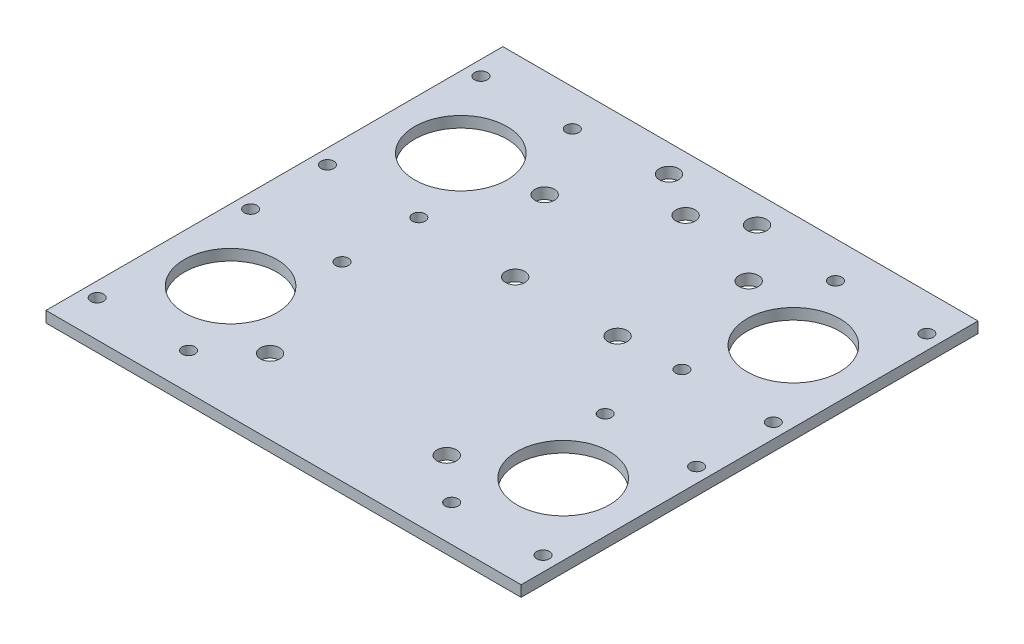
ISO-10303-21;
HEADER;
FILE_DESCRIPTION(('STEP AP214'),'2;1');
FILE_NAME('part.step','',(''),(''),'','','');
FILE_SCHEMA(('AUTOMOTIVE_DESIGN { 1 0 10303 214 1 1 1 1 }'));
ENDSEC;
DATA;
#1=APPLICATION_CONTEXT('core data for automotive mechanical design processes');
#2=APPLICATION_PROTOCOL_DEFINITION('international standard','automotive_design',2000,#1);
#3=PRODUCT_CONTEXT('',#1,'mechanical');
#4=PRODUCT('Part','Part','',(#3));
#5=PRODUCT_RELATED_PRODUCT_CATEGORY('part','',(#4));
#6=PRODUCT_DEFINITION_FORMATION('','',#4);
#7=PRODUCT_DEFINITION_CONTEXT('part definition',#1,'design');
#8=PRODUCT_DEFINITION('design','',#6,#7);
#9=PRODUCT_DEFINITION_SHAPE('','',#8);
#10=(LENGTH_UNIT() NAMED_UNIT(*) SI_UNIT(.MILLI.,.METRE.));
#11=(NAMED_UNIT(*) PLANE_ANGLE_UNIT() SI_UNIT($,.RADIAN.));
#12=(NAMED_UNIT(*) SI_UNIT($,.STERADIAN.) SOLID_ANGLE_UNIT());
#13=UNCERTAINTY_MEASURE_WITH_UNIT(LENGTH_MEASURE(1.E-05),#10,'distance_accuracy_value','');
#14=(GEOMETRIC_REPRESENTATION_CONTEXT(3) GLOBAL_UNCERTAINTY_ASSIGNED_CONTEXT((#13)) GLOBAL_UNIT_ASSIGNED_CONTEXT((#10,
#11,#12)) REPRESENTATION_CONTEXT('',''));
#15=CARTESIAN_POINT('',(0.,0.,0.));
#16=DIRECTION('',(0.,0.,1.));
#17=DIRECTION('',(1.,0.,0.));
#18=AXIS2_PLACEMENT_3D('',#15,#16,#17);
#19=CARTESIAN_POINT('',(65.,3.,-62.5));
#20=DIRECTION('',(-1.,0.,0.));
#21=DIRECTION('',(0.,0.,1.));
#22=AXIS2_PLACEMENT_3D('',#19,#20,#21);
#23=PLANE('',#22);
#24=DIRECTION('',(0.,0.,-1.));
#25=VECTOR('',#24,1.);
#26=CARTESIAN_POINT('',(65.,0.,-62.5));
#27=LINE('',#26,#25);
#28=CARTESIAN_POINT('',(65.,0.,62.5));
#29=VERTEX_POINT('',#28);
#30=CARTESIAN_POINT('',(65.,0.,-62.5));
#31=VERTEX_POINT('',#30);
#32=EDGE_CURVE('E109',#29,#31,#27,.T.);
#33=ORIENTED_EDGE('',*,*,#32,.T.);
#34=DIRECTION('',(0.,-1.,0.));
#35=VECTOR('',#34,1.);
#36=CARTESIAN_POINT('',(65.,3.,-62.5));
#37=LINE('',#36,#35);
#38=CARTESIAN_POINT('',(65.,3.,-62.5));
#39=VERTEX_POINT('',#38);
#40=EDGE_CURVE('E11',#39,#31,#37,.T.);
#41=ORIENTED_EDGE('',*,*,#40,.F.);
#42=DIRECTION('',(0.,0.,-1.));
#43=VECTOR('',#42,1.);
#44=CARTESIAN_POINT('',(65.,3.,-62.5));
#45=LINE('',#44,#43);
#46=CARTESIAN_POINT('',(65.,3.,62.5));
#47=VERTEX_POINT('',#46);
#48=EDGE_CURVE('E92',#47,#39,#45,.T.);
#49=ORIENTED_EDGE('',*,*,#48,.F.);
#50=DIRECTION('',(0.,-1.,0.));
#51=VECTOR('',#50,1.);
#52=CARTESIAN_POINT('',(65.,3.,62.5));
#53=LINE('',#52,#51);
#54=EDGE_CURVE('E105',#47,#29,#53,.T.);
#55=ORIENTED_EDGE('',*,*,#54,.T.);
#56=EDGE_LOOP('',(#33,#41,#49,#55));
#57=FACE_BOUND('',#56,.T.);
#58=ADVANCED_FACE('F38',(#57),#23,.F.);
#59=CARTESIAN_POINT('',(-65.,3.,-62.5));
#60=DIRECTION('',(0.,0.,1.));
#61=DIRECTION('',(1.,0.,0.));
#62=AXIS2_PLACEMENT_3D('',#59,#60,#61);
#63=PLANE('',#62);
#64=DIRECTION('',(-1.,0.,0.));
#65=VECTOR('',#64,1.);
#66=CARTESIAN_POINT('',(-65.,0.,-62.5));
#67=LINE('',#66,#65);
#68=CARTESIAN_POINT('',(-65.,0.,-62.5));
#69=VERTEX_POINT('',#68);
#70=EDGE_CURVE('E97',#31,#69,#67,.T.);
#71=ORIENTED_EDGE('',*,*,#70,.T.);
#72=DIRECTION('',(0.,-1.,0.));
#73=VECTOR('',#72,1.);
#74=CARTESIAN_POINT('',(-65.,3.,-62.5));
#75=LINE('',#74,#73);
#76=CARTESIAN_POINT('',(-65.,3.,-62.5));
#77=VERTEX_POINT('',#76);
#78=EDGE_CURVE('E48',#77,#69,#75,.T.);
#79=ORIENTED_EDGE('',*,*,#78,.F.);
#80=DIRECTION('',(-1.,0.,0.));
#81=VECTOR('',#80,1.);
#82=CARTESIAN_POINT('',(-65.,3.,-62.5));
#83=LINE('',#82,#81);
#84=EDGE_CURVE('E87',#39,#77,#83,.T.);
#85=ORIENTED_EDGE('',*,*,#84,.F.);
#86=ORIENTED_EDGE('',*,*,#40,.T.);
#87=EDGE_LOOP('',(#71,#79,#85,#86));
#88=FACE_BOUND('',#87,.T.);
#89=ADVANCED_FACE('F96',(#88),#63,.F.);
#90=CARTESIAN_POINT('',(-65.,3.,-62.5));
#91=DIRECTION('',(1.,0.,0.));
#92=DIRECTION('',(0.,0.,-1.));
#93=AXIS2_PLACEMENT_3D('',#90,#91,#92);
#94=PLANE('',#93);
#95=DIRECTION('',(0.,0.,1.));
#96=VECTOR('',#95,1.);
#97=CARTESIAN_POINT('',(-65.,0.,-62.5));
#98=LINE('',#97,#96);
#99=CARTESIAN_POINT('',(-65.,0.,62.5));
#100=VERTEX_POINT('',#99);
#101=EDGE_CURVE('E74',#69,#100,#98,.T.);
#102=ORIENTED_EDGE('',*,*,#101,.T.);
#103=DIRECTION('',(0.,-1.,0.));
#104=VECTOR('',#103,1.);
#105=CARTESIAN_POINT('',(-65.,3.,62.5));
#106=LINE('',#105,#104);
#107=CARTESIAN_POINT('',(-65.,3.,62.5));
#108=VERTEX_POINT('',#107);
#109=EDGE_CURVE('E99',#108,#100,#106,.T.);
#110=ORIENTED_EDGE('',*,*,#109,.F.);
#111=DIRECTION('',(0.,0.,1.));
#112=VECTOR('',#111,1.);
#113=CARTESIAN_POINT('',(-65.,3.,-62.5));
#114=LINE('',#113,#112);
#115=EDGE_CURVE('E90',#77,#108,#114,.T.);
#116=ORIENTED_EDGE('',*,*,#115,.F.);
#117=ORIENTED_EDGE('',*,*,#78,.T.);
#118=EDGE_LOOP('',(#102,#110,#116,#117));
#119=FACE_BOUND('',#118,.T.);
#120=ADVANCED_FACE('F101',(#119),#94,.F.);
#121=CARTESIAN_POINT('',(-65.,3.,62.5));
#122=DIRECTION('',(0.,0.,-1.));
#123=DIRECTION('',(-1.,0.,0.));
#124=AXIS2_PLACEMENT_3D('',#121,#122,#123);
#125=PLANE('',#124);
#126=DIRECTION('',(1.,0.,0.));
#127=VECTOR('',#126,1.);
#128=CARTESIAN_POINT('',(-65.,0.,62.5));
#129=LINE('',#128,#127);
#130=EDGE_CURVE('E80',#100,#29,#129,.T.);
#131=ORIENTED_EDGE('',*,*,#130,.T.);
#132=ORIENTED_EDGE('',*,*,#54,.F.);
#133=DIRECTION('',(1.,0.,0.));
#134=VECTOR('',#133,1.);
#135=CARTESIAN_POINT('',(-65.,3.,62.5));
#136=LINE('',#135,#134);
#137=EDGE_CURVE('E57',#108,#47,#136,.T.);
#138=ORIENTED_EDGE('',*,*,#137,.F.);
#139=ORIENTED_EDGE('',*,*,#109,.T.);
#140=EDGE_LOOP('',(#131,#132,#138,#139));
#141=FACE_BOUND('',#140,.T.);
#142=ADVANCED_FACE('F368',(#141),#125,.F.);
#143=CARTESIAN_POINT('',(0.,3.,0.));
#144=DIRECTION('',(0.,1.,0.));
#145=DIRECTION('',(0.,0.,1.));
#146=AXIS2_PLACEMENT_3D('',#143,#144,#145);
#147=PLANE('',#146);
#148=CARTESIAN_POINT('',(0.,3.,-47.5));
#149=DIRECTION('',(0.,1.,0.));
#150=DIRECTION('',(0.,0.,1.));
#151=AXIS2_PLACEMENT_3D('',#148,#149,#150);
#152=CIRCLE('',#151,2.65);
#153=CARTESIAN_POINT('',(0.,3.,-44.85));
#154=VERTEX_POINT('',#153);
#155=EDGE_CURVE('E240',#154,#154,#152,.T.);
#156=ORIENTED_EDGE('',*,*,#155,.F.);
#157=EDGE_LOOP('',(#156));
#158=FACE_BOUND('',#157,.T.);
#159=CARTESIAN_POINT('',(12.0498102049993,3.,-55.));
#160=DIRECTION('',(0.,1.,0.));
#161=DIRECTION('',(0.,0.,1.));
#162=AXIS2_PLACEMENT_3D('',#159,#160,#161);
#163=CIRCLE('',#162,2.65);
#164=CARTESIAN_POINT('',(12.0498102049993,3.,-52.35));
#165=VERTEX_POINT('',#164);
#166=EDGE_CURVE('E354',#165,#165,#163,.T.);
#167=ORIENTED_EDGE('',*,*,#166,.F.);
#168=EDGE_LOOP('',(#167));
#169=FACE_BOUND('',#168,.T.);
#170=CARTESIAN_POINT('',(-12.0498102049993,3.,-55.));
#171=DIRECTION('',(0.,1.,0.));
#172=DIRECTION('',(0.,0.,1.));
#173=AXIS2_PLACEMENT_3D('',#170,#171,#172);
#174=CIRCLE('',#173,2.65);
#175=CARTESIAN_POINT('',(-12.0498102049993,3.,-52.35));
#176=VERTEX_POINT('',#175);
#177=EDGE_CURVE('E350',#176,#176,#174,.T.);
#178=ORIENTED_EDGE('',*,*,#177,.F.);
#179=EDGE_LOOP('',(#178));
#180=FACE_BOUND('',#179,.T.);
#181=CARTESIAN_POINT('',(24.17,3.,-40.6));
#182=DIRECTION('',(0.,1.,0.));
#183=DIRECTION('',(0.,0.,1.));
#184=AXIS2_PLACEMENT_3D('',#181,#182,#183);
#185=CIRCLE('',#184,2.65);
#186=CARTESIAN_POINT('',(24.17,3.,-37.95));
#187=VERTEX_POINT('',#186);
#188=EDGE_CURVE('E247',#187,#187,#185,.T.);
#189=ORIENTED_EDGE('',*,*,#188,.F.);
#190=EDGE_LOOP('',(#189));
#191=FACE_BOUND('',#190,.T.);
#192=CARTESIAN_POINT('',(24.17,3.,42.03));
#193=DIRECTION('',(0.,1.,0.));
#194=DIRECTION('',(0.,0.,1.));
#195=AXIS2_PLACEMENT_3D('',#192,#193,#194);
#196=CIRCLE('',#195,2.65);
#197=CARTESIAN_POINT('',(24.17,3.,44.68));
#198=VERTEX_POINT('',#197);
#199=EDGE_CURVE('E267',#198,#198,#196,.T.);
#200=ORIENTED_EDGE('',*,*,#199,.F.);
#201=EDGE_LOOP('',(#200));
#202=FACE_BOUND('',#201,.T.);
#203=CARTESIAN_POINT('',(-8.73,3.,-9.6));
#204=DIRECTION('',(0.,1.,0.));
#205=DIRECTION('',(0.,0.,1.));
#206=AXIS2_PLACEMENT_3D('',#203,#204,#205);
#207=CIRCLE('',#206,2.65);
#208=CARTESIAN_POINT('',(-8.73,3.,-6.95));
#209=VERTEX_POINT('',#208);
#210=EDGE_CURVE('E262',#209,#209,#207,.T.);
#211=ORIENTED_EDGE('',*,*,#210,.F.);
#212=EDGE_LOOP('',(#211));
#213=FACE_BOUND('',#212,.T.);
#214=CARTESIAN_POINT('',(19.29,3.,-9.6));
#215=DIRECTION('',(0.,1.,0.));
#216=DIRECTION('',(0.,0.,1.));
#217=AXIS2_PLACEMENT_3D('',#214,#215,#216);
#218=CIRCLE('',#217,2.65);
#219=CARTESIAN_POINT('',(19.29,3.,-6.95));
#220=VERTEX_POINT('',#219);
#221=EDGE_CURVE('E258',#220,#220,#218,.T.);
#222=ORIENTED_EDGE('',*,*,#221,.F.);
#223=EDGE_LOOP('',(#222));
#224=FACE_BOUND('',#223,.T.);
#225=CARTESIAN_POINT('',(-24.17,3.,-33.11));
#226=DIRECTION('',(0.,1.,0.));
#227=DIRECTION('',(0.,0.,1.));
#228=AXIS2_PLACEMENT_3D('',#225,#226,#227);
#229=CIRCLE('',#228,2.65);
#230=CARTESIAN_POINT('',(-24.17,3.,-30.46));
#231=VERTEX_POINT('',#230);
#232=EDGE_CURVE('E252',#231,#231,#229,.T.);
#233=ORIENTED_EDGE('',*,*,#232,.F.);
#234=EDGE_LOOP('',(#233));
#235=FACE_BOUND('',#234,.T.);
#236=CARTESIAN_POINT('',(-24.17,3.,42.03));
#237=DIRECTION('',(0.,1.,0.));
#238=DIRECTION('',(0.,0.,1.));
#239=AXIS2_PLACEMENT_3D('',#236,#237,#238);
#240=CIRCLE('',#239,2.65);
#241=CARTESIAN_POINT('',(-24.17,3.,44.68));
#242=VERTEX_POINT('',#241);
#243=EDGE_CURVE('E215',#242,#242,#240,.T.);
#244=ORIENTED_EDGE('',*,*,#243,.F.);
#245=EDGE_LOOP('',(#244));
#246=FACE_BOUND('',#245,.T.);
#247=CARTESIAN_POINT('',(-36.,3.,-52.5));
#248=DIRECTION('',(0.,-1.,0.));
#249=DIRECTION('',(0.,0.,-1.));
#250=AXIS2_PLACEMENT_3D('',#247,#248,#249);
#251=CIRCLE('',#250,1.75);
#252=CARTESIAN_POINT('',(-36.,3.,-54.25));
#253=VERTEX_POINT('',#252);
#254=EDGE_CURVE('E276',#253,#253,#251,.T.);
#255=ORIENTED_EDGE('',*,*,#254,.T.);
#256=EDGE_LOOP('',(#255));
#257=FACE_BOUND('',#256,.T.);
#258=CARTESIAN_POINT('',(-36.,3.,-10.5));
#259=DIRECTION('',(0.,-1.,0.));
#260=DIRECTION('',(0.,0.,-1.));
#261=AXIS2_PLACEMENT_3D('',#258,#259,#260);
#262=CIRCLE('',#261,1.75);
#263=CARTESIAN_POINT('',(-36.,3.,-12.25));
#264=VERTEX_POINT('',#263);
#265=EDGE_CURVE('E272',#264,#264,#262,.T.);
#266=ORIENTED_EDGE('',*,*,#265,.T.);
#267=EDGE_LOOP('',(#266));
#268=FACE_BOUND('',#267,.T.);
#269=CARTESIAN_POINT('',(-61.,3.,-10.5));
#270=DIRECTION('',(0.,-1.,0.));
#271=DIRECTION('',(0.,0.,-1.));
#272=AXIS2_PLACEMENT_3D('',#269,#270,#271);
#273=CIRCLE('',#272,1.75);
#274=CARTESIAN_POINT('',(-61.,3.,-12.25));
#275=VERTEX_POINT('',#274);
#276=EDGE_CURVE('E268',#275,#275,#273,.T.);
#277=ORIENTED_EDGE('',*,*,#276,.T.);
#278=EDGE_LOOP('',(#277));
#279=FACE_BOUND('',#278,.T.);
#280=CARTESIAN_POINT('',(-45.5,3.,-31.5));
#281=DIRECTION('',(0.,-1.,0.));
#282=DIRECTION('',(0.,0.,-1.));
#283=AXIS2_PLACEMENT_3D('',#280,#281,#282);
#284=CIRCLE('',#283,12.65);
#285=CARTESIAN_POINT('',(-45.5,3.,-44.15));
#286=VERTEX_POINT('',#285);
#287=EDGE_CURVE('E235',#286,#286,#284,.T.);
#288=ORIENTED_EDGE('',*,*,#287,.T.);
#289=EDGE_LOOP('',(#288));
#290=FACE_BOUND('',#289,.T.);
#291=CARTESIAN_POINT('',(-61.,3.,-52.5));
#292=DIRECTION('',(0.,-1.,0.));
#293=DIRECTION('',(0.,0.,-1.));
#294=AXIS2_PLACEMENT_3D('',#291,#292,#293);
#295=CIRCLE('',#294,1.75);
#296=CARTESIAN_POINT('',(-61.,3.,-54.25));
#297=VERTEX_POINT('',#296);
#298=EDGE_CURVE('E193',#297,#297,#295,.T.);
#299=ORIENTED_EDGE('',*,*,#298,.T.);
#300=EDGE_LOOP('',(#299));
#301=FACE_BOUND('',#300,.T.);
#302=CARTESIAN_POINT('',(36.,3.,-52.5));
#303=DIRECTION('',(0.,1.,0.));
#304=DIRECTION('',(0.,0.,-1.));
#305=AXIS2_PLACEMENT_3D('',#302,#303,#304);
#306=CIRCLE('',#305,1.75);
#307=CARTESIAN_POINT('',(36.,3.,-54.25));
#308=VERTEX_POINT('',#307);
#309=EDGE_CURVE('E294',#308,#308,#306,.T.);
#310=ORIENTED_EDGE('',*,*,#309,.F.);
#311=EDGE_LOOP('',(#310));
#312=FACE_BOUND('',#311,.T.);
#313=CARTESIAN_POINT('',(36.,3.,-10.5));
#314=DIRECTION('',(0.,1.,0.));
#315=DIRECTION('',(0.,0.,-1.));
#316=AXIS2_PLACEMENT_3D('',#313,#314,#315);
#317=CIRCLE('',#316,1.75);
#318=CARTESIAN_POINT('',(36.,3.,-12.25));
#319=VERTEX_POINT('',#318);
#320=EDGE_CURVE('E290',#319,#319,#317,.T.);
#321=ORIENTED_EDGE('',*,*,#320,.F.);
#322=EDGE_LOOP('',(#321));
#323=FACE_BOUND('',#322,.T.);
#324=CARTESIAN_POINT('',(61.,3.,-10.5));
#325=DIRECTION('',(0.,1.,0.));
#326=DIRECTION('',(0.,0.,-1.));
#327=AXIS2_PLACEMENT_3D('',#324,#325,#326);
#328=CIRCLE('',#327,1.75);
#329=CARTESIAN_POINT('',(61.,3.,-12.25));
#330=VERTEX_POINT('',#329);
#331=EDGE_CURVE('E286',#330,#330,#328,.T.);
#332=ORIENTED_EDGE('',*,*,#331,.F.);
#333=EDGE_LOOP('',(#332));
#334=FACE_BOUND('',#333,.T.);
#335=CARTESIAN_POINT('',(45.5,3.,-31.5));
#336=DIRECTION('',(0.,1.,0.));
#337=DIRECTION('',(0.,0.,-1.));
#338=AXIS2_PLACEMENT_3D('',#335,#336,#337);
#339=CIRCLE('',#338,12.65);
#340=CARTESIAN_POINT('',(45.5,3.,-44.15));
#341=VERTEX_POINT('',#340);
#342=EDGE_CURVE('E209',#341,#341,#339,.T.);
#343=ORIENTED_EDGE('',*,*,#342,.F.);
#344=EDGE_LOOP('',(#343));
#345=FACE_BOUND('',#344,.T.);
#346=CARTESIAN_POINT('',(61.,3.,-52.5));
#347=DIRECTION('',(0.,1.,0.));
#348=DIRECTION('',(0.,0.,-1.));
#349=AXIS2_PLACEMENT_3D('',#346,#347,#348);
#350=CIRCLE('',#349,1.75);
#351=CARTESIAN_POINT('',(61.,3.,-54.25));
#352=VERTEX_POINT('',#351);
#353=EDGE_CURVE('E171',#352,#352,#350,.T.);
#354=ORIENTED_EDGE('',*,*,#353,.F.);
#355=EDGE_LOOP('',(#354));
#356=FACE_BOUND('',#355,.T.);
#357=CARTESIAN_POINT('',(36.,3.,52.5));
#358=DIRECTION('',(0.,-1.,0.));
#359=DIRECTION('',(0.,0.,1.));
#360=AXIS2_PLACEMENT_3D('',#357,#358,#359);
#361=CIRCLE('',#360,1.75);
#362=CARTESIAN_POINT('',(36.,3.,54.25));
#363=VERTEX_POINT('',#362);
#364=EDGE_CURVE('E312',#363,#363,#361,.T.);
#365=ORIENTED_EDGE('',*,*,#364,.T.);
#366=EDGE_LOOP('',(#365));
#367=FACE_BOUND('',#366,.T.);
#368=CARTESIAN_POINT('',(36.,3.,10.5));
#369=DIRECTION('',(0.,-1.,0.));
#370=DIRECTION('',(0.,0.,1.));
#371=AXIS2_PLACEMENT_3D('',#368,#369,#370);
#372=CIRCLE('',#371,1.75);
#373=CARTESIAN_POINT('',(36.,3.,12.25));
#374=VERTEX_POINT('',#373);
#375=EDGE_CURVE('E308',#374,#374,#372,.T.);
#376=ORIENTED_EDGE('',*,*,#375,.T.);
#377=EDGE_LOOP('',(#376));
#378=FACE_BOUND('',#377,.T.);
#379=CARTESIAN_POINT('',(61.,3.,10.5));
#380=DIRECTION('',(0.,-1.,0.));
#381=DIRECTION('',(0.,0.,1.));
#382=AXIS2_PLACEMENT_3D('',#379,#380,#381);
#383=CIRCLE('',#382,1.75);
#384=CARTESIAN_POINT('',(61.,3.,12.25));
#385=VERTEX_POINT('',#384);
#386=EDGE_CURVE('E304',#385,#385,#383,.T.);
#387=ORIENTED_EDGE('',*,*,#386,.T.);
#388=EDGE_LOOP('',(#387));
#389=FACE_BOUND('',#388,.T.);
#390=CARTESIAN_POINT('',(45.5,3.,31.5));
#391=DIRECTION('',(0.,-1.,0.));
#392=DIRECTION('',(0.,0.,1.));
#393=AXIS2_PLACEMENT_3D('',#390,#391,#392);
#394=CIRCLE('',#393,12.65);
#395=CARTESIAN_POINT('',(45.5,3.,44.15));
#396=VERTEX_POINT('',#395);
#397=EDGE_CURVE('E187',#396,#396,#394,.T.);
#398=ORIENTED_EDGE('',*,*,#397,.T.);
#399=EDGE_LOOP('',(#398));
#400=FACE_BOUND('',#399,.T.);
#401=CARTESIAN_POINT('',(61.,3.,52.5));
#402=DIRECTION('',(0.,-1.,0.));
#403=DIRECTION('',(0.,0.,1.));
#404=AXIS2_PLACEMENT_3D('',#401,#402,#403);
#405=CIRCLE('',#404,1.75);
#406=CARTESIAN_POINT('',(61.,3.,54.25));
#407=VERTEX_POINT('',#406);
#408=EDGE_CURVE('E149',#407,#407,#405,.T.);
#409=ORIENTED_EDGE('',*,*,#408,.T.);
#410=EDGE_LOOP('',(#409));
#411=FACE_BOUND('',#410,.T.);
#412=CARTESIAN_POINT('',(-36.,3.,52.5));
#413=DIRECTION('',(0.,1.,0.));
#414=DIRECTION('',(0.,0.,1.));
#415=AXIS2_PLACEMENT_3D('',#412,#413,#414);
#416=CIRCLE('',#415,1.75);
#417=CARTESIAN_POINT('',(-36.,3.,54.25));
#418=VERTEX_POINT('',#417);
#419=EDGE_CURVE('E330',#418,#418,#416,.T.);
#420=ORIENTED_EDGE('',*,*,#419,.F.);
#421=EDGE_LOOP('',(#420));
#422=FACE_BOUND('',#421,.T.);
#423=CARTESIAN_POINT('',(-36.,3.,10.5));
#424=DIRECTION('',(0.,1.,0.));
#425=DIRECTION('',(0.,0.,1.));
#426=AXIS2_PLACEMENT_3D('',#423,#424,#425);
#427=CIRCLE('',#426,1.75);
#428=CARTESIAN_POINT('',(-36.,3.,12.25));
#429=VERTEX_POINT('',#428);
#430=EDGE_CURVE('E326',#429,#429,#427,.T.);
#431=ORIENTED_EDGE('',*,*,#430,.F.);
#432=EDGE_LOOP('',(#431));
#433=FACE_BOUND('',#432,.T.);
#434=CARTESIAN_POINT('',(-61.,3.,10.5));
#435=DIRECTION('',(0.,1.,0.));
#436=DIRECTION('',(0.,0.,1.));
#437=AXIS2_PLACEMENT_3D('',#434,#435,#436);
#438=CIRCLE('',#437,1.75);
#439=CARTESIAN_POINT('',(-61.,3.,12.25));
#440=VERTEX_POINT('',#439);
#441=EDGE_CURVE('E322',#440,#440,#438,.T.);
#442=ORIENTED_EDGE('',*,*,#441,.F.);
#443=EDGE_LOOP('',(#442));
#444=FACE_BOUND('',#443,.T.);
#445=CARTESIAN_POINT('',(-45.5,3.,31.5));
#446=DIRECTION('',(0.,1.,0.));
#447=DIRECTION('',(0.,0.,1.));
#448=AXIS2_PLACEMENT_3D('',#445,#446,#447);
#449=CIRCLE('',#448,12.65);
#450=CARTESIAN_POINT('',(-45.5,3.,44.15));
#451=VERTEX_POINT('',#450);
#452=EDGE_CURVE('E165',#451,#451,#449,.T.);
#453=ORIENTED_EDGE('',*,*,#452,.F.);
#454=EDGE_LOOP('',(#453));
#455=FACE_BOUND('',#454,.T.);
#456=CARTESIAN_POINT('',(-61.,3.,52.5));
#457=DIRECTION('',(0.,1.,0.));
#458=DIRECTION('',(0.,0.,1.));
#459=AXIS2_PLACEMENT_3D('',#456,#457,#458);
#460=CIRCLE('',#459,1.75);
#461=CARTESIAN_POINT('',(-61.,3.,54.25));
#462=VERTEX_POINT('',#461);
#463=EDGE_CURVE('E129',#462,#462,#460,.T.);
#464=ORIENTED_EDGE('',*,*,#463,.F.);
#465=EDGE_LOOP('',(#464));
#466=FACE_BOUND('',#465,.T.);
#467=ORIENTED_EDGE('',*,*,#48,.T.);
#468=ORIENTED_EDGE('',*,*,#84,.T.);
#469=ORIENTED_EDGE('',*,*,#115,.T.);
#470=ORIENTED_EDGE('',*,*,#137,.T.);
#471=EDGE_LOOP('',(#467,#468,#469,#470));
#472=FACE_BOUND('',#471,.T.);
#473=ADVANCED_FACE('F88',(#158,#169,#180,#191,#202,#213,#224,#235,#246,#257,#268,#279,#290,#301,
#312,#323,#334,#345,#356,#367,#378,#389,#400,#411,#422,#433,#444,#455,#466,#472),#147,.T.);
#474=CARTESIAN_POINT('',(0.,0.,0.));
#475=DIRECTION('',(0.,1.,0.));
#476=DIRECTION('',(0.,0.,1.));
#477=AXIS2_PLACEMENT_3D('',#474,#475,#476);
#478=PLANE('',#477);
#479=CARTESIAN_POINT('',(0.,0.,-47.5));
#480=DIRECTION('',(0.,1.,0.));
#481=DIRECTION('',(0.,0.,1.));
#482=AXIS2_PLACEMENT_3D('',#479,#480,#481);
#483=CIRCLE('',#482,2.65);
#484=CARTESIAN_POINT('',(0.,0.,-44.85));
#485=VERTEX_POINT('',#484);
#486=EDGE_CURVE('E41',#485,#485,#483,.T.);
#487=ORIENTED_EDGE('',*,*,#486,.T.);
#488=EDGE_LOOP('',(#487));
#489=FACE_BOUND('',#488,.T.);
#490=CARTESIAN_POINT('',(12.0498102049993,0.,-55.));
#491=DIRECTION('',(0.,1.,0.));
#492=DIRECTION('',(0.,0.,1.));
#493=AXIS2_PLACEMENT_3D('',#490,#491,#492);
#494=CIRCLE('',#493,2.65);
#495=CARTESIAN_POINT('',(12.0498102049993,0.,-52.35));
#496=VERTEX_POINT('',#495);
#497=EDGE_CURVE('E239',#496,#496,#494,.T.);
#498=ORIENTED_EDGE('',*,*,#497,.T.);
#499=EDGE_LOOP('',(#498));
#500=FACE_BOUND('',#499,.T.);
#501=CARTESIAN_POINT('',(-12.0498102049993,0.,-55.));
#502=DIRECTION('',(0.,1.,0.));
#503=DIRECTION('',(0.,0.,1.));
#504=AXIS2_PLACEMENT_3D('',#501,#502,#503);
#505=CIRCLE('',#504,2.65);
#506=CARTESIAN_POINT('',(-12.0498102049993,0.,-52.35));
#507=VERTEX_POINT('',#506);
#508=EDGE_CURVE('E236',#507,#507,#505,.T.);
#509=ORIENTED_EDGE('',*,*,#508,.T.);
#510=EDGE_LOOP('',(#509));
#511=FACE_BOUND('',#510,.T.);
#512=CARTESIAN_POINT('',(24.17,0.,-40.6));
#513=DIRECTION('',(0.,1.,0.));
#514=DIRECTION('',(0.,0.,1.));
#515=AXIS2_PLACEMENT_3D('',#512,#513,#514);
#516=CIRCLE('',#515,2.65);
#517=CARTESIAN_POINT('',(24.17,0.,-37.95));
#518=VERTEX_POINT('',#517);
#519=EDGE_CURVE('E231',#518,#518,#516,.T.);
#520=ORIENTED_EDGE('',*,*,#519,.T.);
#521=EDGE_LOOP('',(#520));
#522=FACE_BOUND('',#521,.T.);
#523=CARTESIAN_POINT('',(24.17,0.,42.03));
#524=DIRECTION('',(0.,1.,0.));
#525=DIRECTION('',(0.,0.,1.));
#526=AXIS2_PLACEMENT_3D('',#523,#524,#525);
#527=CIRCLE('',#526,2.65);
#528=CARTESIAN_POINT('',(24.17,0.,44.68));
#529=VERTEX_POINT('',#528);
#530=EDGE_CURVE('E227',#529,#529,#527,.T.);
#531=ORIENTED_EDGE('',*,*,#530,.T.);
#532=EDGE_LOOP('',(#531));
#533=FACE_BOUND('',#532,.T.);
#534=CARTESIAN_POINT('',(-8.73,0.,-9.6));
#535=DIRECTION('',(0.,1.,0.));
#536=DIRECTION('',(0.,0.,1.));
#537=AXIS2_PLACEMENT_3D('',#534,#535,#536);
#538=CIRCLE('',#537,2.65);
#539=CARTESIAN_POINT('',(-8.73,0.,-6.95));
#540=VERTEX_POINT('',#539);
#541=EDGE_CURVE('E223',#540,#540,#538,.T.);
#542=ORIENTED_EDGE('',*,*,#541,.T.);
#543=EDGE_LOOP('',(#542));
#544=FACE_BOUND('',#543,.T.);
#545=CARTESIAN_POINT('',(19.29,0.,-9.6));
#546=DIRECTION('',(0.,1.,0.));
#547=DIRECTION('',(0.,0.,1.));
#548=AXIS2_PLACEMENT_3D('',#545,#546,#547);
#549=CIRCLE('',#548,2.65);
#550=CARTESIAN_POINT('',(19.29,0.,-6.95));
#551=VERTEX_POINT('',#550);
#552=EDGE_CURVE('E219',#551,#551,#549,.T.);
#553=ORIENTED_EDGE('',*,*,#552,.T.);
#554=EDGE_LOOP('',(#553));
#555=FACE_BOUND('',#554,.T.);
#556=CARTESIAN_POINT('',(-24.17,0.,-33.11));
#557=DIRECTION('',(0.,1.,0.));
#558=DIRECTION('',(0.,0.,1.));
#559=AXIS2_PLACEMENT_3D('',#556,#557,#558);
#560=CIRCLE('',#559,2.65);
#561=CARTESIAN_POINT('',(-24.17,0.,-30.46));
#562=VERTEX_POINT('',#561);
#563=EDGE_CURVE('E214',#562,#562,#560,.T.);
#564=ORIENTED_EDGE('',*,*,#563,.T.);
#565=EDGE_LOOP('',(#564));
#566=FACE_BOUND('',#565,.T.);
#567=CARTESIAN_POINT('',(-24.17,0.,42.03));
#568=DIRECTION('',(0.,1.,0.));
#569=DIRECTION('',(0.,0.,1.));
#570=AXIS2_PLACEMENT_3D('',#567,#568,#569);
#571=CIRCLE('',#570,2.65);
#572=CARTESIAN_POINT('',(-24.17,0.,44.68));
#573=VERTEX_POINT('',#572);
#574=EDGE_CURVE('E210',#573,#573,#571,.T.);
#575=ORIENTED_EDGE('',*,*,#574,.T.);
#576=EDGE_LOOP('',(#575));
#577=FACE_BOUND('',#576,.T.);
#578=CARTESIAN_POINT('',(-36.,0.,-52.5));
#579=DIRECTION('',(0.,1.,0.));
#580=DIRECTION('',(0.,0.,1.));
#581=AXIS2_PLACEMENT_3D('',#578,#579,#580);
#582=CIRCLE('',#581,1.75);
#583=CARTESIAN_POINT('',(-36.,0.,-50.75));
#584=VERTEX_POINT('',#583);
#585=EDGE_CURVE('E205',#584,#584,#582,.F.);
#586=ORIENTED_EDGE('',*,*,#585,.F.);
#587=EDGE_LOOP('',(#586));
#588=FACE_BOUND('',#587,.T.);
#589=CARTESIAN_POINT('',(-36.,0.,-10.5));
#590=DIRECTION('',(0.,1.,0.));
#591=DIRECTION('',(0.,0.,1.));
#592=AXIS2_PLACEMENT_3D('',#589,#590,#591);
#593=CIRCLE('',#592,1.75);
#594=CARTESIAN_POINT('',(-36.,0.,-8.74999999999999));
#595=VERTEX_POINT('',#594);
#596=EDGE_CURVE('E201',#595,#595,#593,.F.);
#597=ORIENTED_EDGE('',*,*,#596,.F.);
#598=EDGE_LOOP('',(#597));
#599=FACE_BOUND('',#598,.T.);
#600=CARTESIAN_POINT('',(-61.,0.,-10.5));
#601=DIRECTION('',(0.,1.,0.));
#602=DIRECTION('',(0.,0.,1.));
#603=AXIS2_PLACEMENT_3D('',#600,#601,#602);
#604=CIRCLE('',#603,1.75);
#605=CARTESIAN_POINT('',(-61.,0.,-8.75));
#606=VERTEX_POINT('',#605);
#607=EDGE_CURVE('E197',#606,#606,#604,.F.);
#608=ORIENTED_EDGE('',*,*,#607,.F.);
#609=EDGE_LOOP('',(#608));
#610=FACE_BOUND('',#609,.T.);
#611=CARTESIAN_POINT('',(-45.5,0.,-31.5));
#612=DIRECTION('',(0.,1.,0.));
#613=DIRECTION('',(0.,0.,1.));
#614=AXIS2_PLACEMENT_3D('',#611,#612,#613);
#615=CIRCLE('',#614,12.65);
#616=CARTESIAN_POINT('',(-45.5,0.,-18.85));
#617=VERTEX_POINT('',#616);
#618=EDGE_CURVE('E192',#617,#617,#615,.F.);
#619=ORIENTED_EDGE('',*,*,#618,.F.);
#620=EDGE_LOOP('',(#619));
#621=FACE_BOUND('',#620,.T.);
#622=CARTESIAN_POINT('',(-61.,0.,-52.5));
#623=DIRECTION('',(0.,1.,0.));
#624=DIRECTION('',(0.,0.,1.));
#625=AXIS2_PLACEMENT_3D('',#622,#623,#624);
#626=CIRCLE('',#625,1.75);
#627=CARTESIAN_POINT('',(-61.,0.,-50.75));
#628=VERTEX_POINT('',#627);
#629=EDGE_CURVE('E188',#628,#628,#626,.F.);
#630=ORIENTED_EDGE('',*,*,#629,.F.);
#631=EDGE_LOOP('',(#630));
#632=FACE_BOUND('',#631,.T.);
#633=CARTESIAN_POINT('',(36.,0.,-52.5));
#634=DIRECTION('',(0.,1.,0.));
#635=DIRECTION('',(0.,0.,1.));
#636=AXIS2_PLACEMENT_3D('',#633,#634,#635);
#637=CIRCLE('',#636,1.75);
#638=CARTESIAN_POINT('',(36.,0.,-50.75));
#639=VERTEX_POINT('',#638);
#640=EDGE_CURVE('E183',#639,#639,#637,.T.);
#641=ORIENTED_EDGE('',*,*,#640,.T.);
#642=EDGE_LOOP('',(#641));
#643=FACE_BOUND('',#642,.T.);
#644=CARTESIAN_POINT('',(36.,0.,-10.5));
#645=DIRECTION('',(0.,1.,0.));
#646=DIRECTION('',(0.,0.,1.));
#647=AXIS2_PLACEMENT_3D('',#644,#645,#646);
#648=CIRCLE('',#647,1.75);
#649=CARTESIAN_POINT('',(36.,0.,-8.74999999999998));
#650=VERTEX_POINT('',#649);
#651=EDGE_CURVE('E179',#650,#650,#648,.T.);
#652=ORIENTED_EDGE('',*,*,#651,.T.);
#653=EDGE_LOOP('',(#652));
#654=FACE_BOUND('',#653,.T.);
#655=CARTESIAN_POINT('',(61.,0.,-10.5));
#656=DIRECTION('',(0.,1.,0.));
#657=DIRECTION('',(0.,0.,1.));
#658=AXIS2_PLACEMENT_3D('',#655,#656,#657);
#659=CIRCLE('',#658,1.75);
#660=CARTESIAN_POINT('',(61.,0.,-8.74999999999998));
#661=VERTEX_POINT('',#660);
#662=EDGE_CURVE('E175',#661,#661,#659,.T.);
#663=ORIENTED_EDGE('',*,*,#662,.T.);
#664=EDGE_LOOP('',(#663));
#665=FACE_BOUND('',#664,.T.);
#666=CARTESIAN_POINT('',(45.5,0.,-31.5));
#667=DIRECTION('',(0.,1.,0.));
#668=DIRECTION('',(0.,0.,1.));
#669=AXIS2_PLACEMENT_3D('',#666,#667,#668);
#670=CIRCLE('',#669,12.65);
#671=CARTESIAN_POINT('',(45.5,0.,-18.85));
#672=VERTEX_POINT('',#671);
#673=EDGE_CURVE('E170',#672,#672,#670,.T.);
#674=ORIENTED_EDGE('',*,*,#673,.T.);
#675=EDGE_LOOP('',(#674));
#676=FACE_BOUND('',#675,.T.);
#677=CARTESIAN_POINT('',(61.,0.,-52.5));
#678=DIRECTION('',(0.,1.,0.));
#679=DIRECTION('',(0.,0.,1.));
#680=AXIS2_PLACEMENT_3D('',#677,#678,#679);
#681=CIRCLE('',#680,1.75);
#682=CARTESIAN_POINT('',(61.,0.,-50.75));
#683=VERTEX_POINT('',#682);
#684=EDGE_CURVE('E166',#683,#683,#681,.T.);
#685=ORIENTED_EDGE('',*,*,#684,.T.);
#686=EDGE_LOOP('',(#685));
#687=FACE_BOUND('',#686,.T.);
#688=CARTESIAN_POINT('',(36.,0.,52.5));
#689=DIRECTION('',(0.,1.,0.));
#690=DIRECTION('',(0.,0.,1.));
#691=AXIS2_PLACEMENT_3D('',#688,#689,#690);
#692=CIRCLE('',#691,1.75);
#693=CARTESIAN_POINT('',(36.,0.,54.25));
#694=VERTEX_POINT('',#693);
#695=EDGE_CURVE('E161',#694,#694,#692,.F.);
#696=ORIENTED_EDGE('',*,*,#695,.F.);
#697=EDGE_LOOP('',(#696));
#698=FACE_BOUND('',#697,.T.);
#699=CARTESIAN_POINT('',(36.,0.,10.5));
#700=DIRECTION('',(0.,1.,0.));
#701=DIRECTION('',(0.,0.,1.));
#702=AXIS2_PLACEMENT_3D('',#699,#700,#701);
#703=CIRCLE('',#702,1.75);
#704=CARTESIAN_POINT('',(36.,0.,12.25));
#705=VERTEX_POINT('',#704);
#706=EDGE_CURVE('E157',#705,#705,#703,.F.);
#707=ORIENTED_EDGE('',*,*,#706,.F.);
#708=EDGE_LOOP('',(#707));
#709=FACE_BOUND('',#708,.T.);
#710=CARTESIAN_POINT('',(61.,0.,10.5));
#711=DIRECTION('',(0.,1.,0.));
#712=DIRECTION('',(0.,0.,1.));
#713=AXIS2_PLACEMENT_3D('',#710,#711,#712);
#714=CIRCLE('',#713,1.75);
#715=CARTESIAN_POINT('',(61.,0.,12.25));
#716=VERTEX_POINT('',#715);
#717=EDGE_CURVE('E153',#716,#716,#714,.F.);
#718=ORIENTED_EDGE('',*,*,#717,.F.);
#719=EDGE_LOOP('',(#718));
#720=FACE_BOUND('',#719,.T.);
#721=CARTESIAN_POINT('',(45.5,0.,31.5));
#722=DIRECTION('',(0.,1.,0.));
#723=DIRECTION('',(0.,0.,1.));
#724=AXIS2_PLACEMENT_3D('',#721,#722,#723);
#725=CIRCLE('',#724,12.65);
#726=CARTESIAN_POINT('',(45.5,0.,44.15));
#727=VERTEX_POINT('',#726);
#728=EDGE_CURVE('E148',#727,#727,#725,.F.);
#729=ORIENTED_EDGE('',*,*,#728,.F.);
#730=EDGE_LOOP('',(#729));
#731=FACE_BOUND('',#730,.T.);
#732=CARTESIAN_POINT('',(61.,0.,52.5));
#733=DIRECTION('',(0.,1.,0.));
#734=DIRECTION('',(0.,0.,1.));
#735=AXIS2_PLACEMENT_3D('',#732,#733,#734);
#736=CIRCLE('',#735,1.75);
#737=CARTESIAN_POINT('',(61.,0.,54.25));
#738=VERTEX_POINT('',#737);
#739=EDGE_CURVE('E144',#738,#738,#736,.F.);
#740=ORIENTED_EDGE('',*,*,#739,.F.);
#741=EDGE_LOOP('',(#740));
#742=FACE_BOUND('',#741,.T.);
#743=CARTESIAN_POINT('',(-36.,0.,52.5));
#744=DIRECTION('',(0.,1.,0.));
#745=DIRECTION('',(0.,0.,1.));
#746=AXIS2_PLACEMENT_3D('',#743,#744,#745);
#747=CIRCLE('',#746,1.75);
#748=CARTESIAN_POINT('',(-36.,0.,54.25));
#749=VERTEX_POINT('',#748);
#750=EDGE_CURVE('E113',#749,#749,#747,.T.);
#751=ORIENTED_EDGE('',*,*,#750,.T.);
#752=EDGE_LOOP('',(#751));
#753=FACE_BOUND('',#752,.T.);
#754=CARTESIAN_POINT('',(-36.,0.,10.5));
#755=DIRECTION('',(0.,1.,0.));
#756=DIRECTION('',(0.,0.,1.));
#757=AXIS2_PLACEMENT_3D('',#754,#755,#756);
#758=CIRCLE('',#757,1.75);
#759=CARTESIAN_POINT('',(-36.,0.,12.25));
#760=VERTEX_POINT('',#759);
#761=EDGE_CURVE('E137',#760,#760,#758,.T.);
#762=ORIENTED_EDGE('',*,*,#761,.T.);
#763=EDGE_LOOP('',(#762));
#764=FACE_BOUND('',#763,.T.);
#765=CARTESIAN_POINT('',(-61.,0.,10.5));
#766=DIRECTION('',(0.,1.,0.));
#767=DIRECTION('',(0.,0.,1.));
#768=AXIS2_PLACEMENT_3D('',#765,#766,#767);
#769=CIRCLE('',#768,1.75);
#770=CARTESIAN_POINT('',(-61.,0.,12.25));
#771=VERTEX_POINT('',#770);
#772=EDGE_CURVE('E133',#771,#771,#769,.T.);
#773=ORIENTED_EDGE('',*,*,#772,.T.);
#774=EDGE_LOOP('',(#773));
#775=FACE_BOUND('',#774,.T.);
#776=CARTESIAN_POINT('',(-45.5,0.,31.5));
#777=DIRECTION('',(0.,1.,0.));
#778=DIRECTION('',(0.,0.,1.));
#779=AXIS2_PLACEMENT_3D('',#776,#777,#778);
#780=CIRCLE('',#779,12.65);
#781=CARTESIAN_POINT('',(-45.5,0.,44.15));
#782=VERTEX_POINT('',#781);
#783=EDGE_CURVE('E128',#782,#782,#780,.T.);
#784=ORIENTED_EDGE('',*,*,#783,.T.);
#785=EDGE_LOOP('',(#784));
#786=FACE_BOUND('',#785,.T.);
#787=CARTESIAN_POINT('',(-61.,0.,52.5));
#788=DIRECTION('',(0.,1.,0.));
#789=DIRECTION('',(0.,0.,1.));
#790=AXIS2_PLACEMENT_3D('',#787,#788,#789);
#791=CIRCLE('',#790,1.75);
#792=CARTESIAN_POINT('',(-61.,0.,54.25));
#793=VERTEX_POINT('',#792);
#794=EDGE_CURVE('E124',#793,#793,#791,.T.);
#795=ORIENTED_EDGE('',*,*,#794,.T.);
#796=EDGE_LOOP('',(#795));
#797=FACE_BOUND('',#796,.T.);
#798=ORIENTED_EDGE('',*,*,#32,.F.);
#799=ORIENTED_EDGE('',*,*,#130,.F.);
#800=ORIENTED_EDGE('',*,*,#101,.F.);
#801=ORIENTED_EDGE('',*,*,#70,.F.);
#802=EDGE_LOOP('',(#798,#799,#800,#801));
#803=FACE_BOUND('',#802,.T.);
#804=ADVANCED_FACE('F367',(#489,#500,#511,#522,#533,#544,#555,#566,#577,#588,#599,#610,#621,
#632,#643,#654,#665,#676,#687,#698,#709,#720,#731,#742,#753,#764,#775,#786,#797,#803),#478,.F.);
#805=CARTESIAN_POINT('',(-61.,-7.,52.5));
#806=DIRECTION('',(0.,1.,0.));
#807=DIRECTION('',(0.,0.,1.));
#808=AXIS2_PLACEMENT_3D('',#805,#806,#807);
#809=CYLINDRICAL_SURFACE('',#808,1.75);
#810=ORIENTED_EDGE('',*,*,#463,.T.);
#811=EDGE_LOOP('',(#810));
#812=FACE_BOUND('',#811,.T.);
#813=ORIENTED_EDGE('',*,*,#794,.F.);
#814=EDGE_LOOP('',(#813));
#815=FACE_BOUND('',#814,.T.);
#816=ADVANCED_FACE('F424',(#812,#815),#809,.F.);
#817=CARTESIAN_POINT('',(-45.5,-7.,31.5));
#818=DIRECTION('',(0.,1.,0.));
#819=DIRECTION('',(0.,0.,1.));
#820=AXIS2_PLACEMENT_3D('',#817,#818,#819);
#821=CYLINDRICAL_SURFACE('',#820,12.65);
#822=ORIENTED_EDGE('',*,*,#452,.T.);
#823=EDGE_LOOP('',(#822));
#824=FACE_BOUND('',#823,.T.);
#825=ORIENTED_EDGE('',*,*,#783,.F.);
#826=EDGE_LOOP('',(#825));
#827=FACE_BOUND('',#826,.T.);
#828=ADVANCED_FACE('F427',(#824,#827),#821,.F.);
#829=CARTESIAN_POINT('',(-61.,-7.,10.5));
#830=DIRECTION('',(0.,1.,0.));
#831=DIRECTION('',(0.,0.,1.));
#832=AXIS2_PLACEMENT_3D('',#829,#830,#831);
#833=CYLINDRICAL_SURFACE('',#832,1.75);
#834=ORIENTED_EDGE('',*,*,#441,.T.);
#835=EDGE_LOOP('',(#834));
#836=FACE_BOUND('',#835,.T.);
#837=ORIENTED_EDGE('',*,*,#772,.F.);
#838=EDGE_LOOP('',(#837));
#839=FACE_BOUND('',#838,.T.);
#840=ADVANCED_FACE('F475',(#836,#839),#833,.F.);
#841=CARTESIAN_POINT('',(-36.,-7.,10.5));
#842=DIRECTION('',(0.,1.,0.));
#843=DIRECTION('',(0.,0.,1.));
#844=AXIS2_PLACEMENT_3D('',#841,#842,#843);
#845=CYLINDRICAL_SURFACE('',#844,1.75);
#846=ORIENTED_EDGE('',*,*,#430,.T.);
#847=EDGE_LOOP('',(#846));
#848=FACE_BOUND('',#847,.T.);
#849=ORIENTED_EDGE('',*,*,#761,.F.);
#850=EDGE_LOOP('',(#849));
#851=FACE_BOUND('',#850,.T.);
#852=ADVANCED_FACE('F485',(#848,#851),#845,.F.);
#853=CARTESIAN_POINT('',(-36.,-7.,52.5));
#854=DIRECTION('',(0.,1.,0.));
#855=DIRECTION('',(0.,0.,1.));
#856=AXIS2_PLACEMENT_3D('',#853,#854,#855);
#857=CYLINDRICAL_SURFACE('',#856,1.75);
#858=ORIENTED_EDGE('',*,*,#419,.T.);
#859=EDGE_LOOP('',(#858));
#860=FACE_BOUND('',#859,.T.);
#861=ORIENTED_EDGE('',*,*,#750,.F.);
#862=EDGE_LOOP('',(#861));
#863=FACE_BOUND('',#862,.T.);
#864=ADVANCED_FACE('F495',(#860,#863),#857,.F.);
#865=CARTESIAN_POINT('',(61.,-7.,52.5));
#866=DIRECTION('',(0.,1.,0.));
#867=DIRECTION('',(0.,0.,1.));
#868=AXIS2_PLACEMENT_3D('',#865,#866,#867);
#869=CYLINDRICAL_SURFACE('',#868,1.75);
#870=ORIENTED_EDGE('',*,*,#408,.F.);
#871=EDGE_LOOP('',(#870));
#872=FACE_BOUND('',#871,.T.);
#873=ORIENTED_EDGE('',*,*,#739,.T.);
#874=EDGE_LOOP('',(#873));
#875=FACE_BOUND('',#874,.T.);
#876=ADVANCED_FACE('F505',(#872,#875),#869,.F.);
#877=CARTESIAN_POINT('',(45.5,-7.,31.5));
#878=DIRECTION('',(0.,1.,0.));
#879=DIRECTION('',(0.,0.,1.));
#880=AXIS2_PLACEMENT_3D('',#877,#878,#879);
#881=CYLINDRICAL_SURFACE('',#880,12.65);
#882=ORIENTED_EDGE('',*,*,#397,.F.);
#883=EDGE_LOOP('',(#882));
#884=FACE_BOUND('',#883,.T.);
#885=ORIENTED_EDGE('',*,*,#728,.T.);
#886=EDGE_LOOP('',(#885));
#887=FACE_BOUND('',#886,.T.);
#888=ADVANCED_FACE('F515',(#884,#887),#881,.F.);
#889=CARTESIAN_POINT('',(61.,-7.,10.5));
#890=DIRECTION('',(0.,1.,0.));
#891=DIRECTION('',(0.,0.,1.));
#892=AXIS2_PLACEMENT_3D('',#889,#890,#891);
#893=CYLINDRICAL_SURFACE('',#892,1.75);
#894=ORIENTED_EDGE('',*,*,#386,.F.);
#895=EDGE_LOOP('',(#894));
#896=FACE_BOUND('',#895,.T.);
#897=ORIENTED_EDGE('',*,*,#717,.T.);
#898=EDGE_LOOP('',(#897));
#899=FACE_BOUND('',#898,.T.);
#900=ADVANCED_FACE('F525',(#896,#899),#893,.F.);
#901=CARTESIAN_POINT('',(36.,-7.,10.5));
#902=DIRECTION('',(0.,1.,0.));
#903=DIRECTION('',(0.,0.,1.));
#904=AXIS2_PLACEMENT_3D('',#901,#902,#903);
#905=CYLINDRICAL_SURFACE('',#904,1.75);
#906=ORIENTED_EDGE('',*,*,#375,.F.);
#907=EDGE_LOOP('',(#906));
#908=FACE_BOUND('',#907,.T.);
#909=ORIENTED_EDGE('',*,*,#706,.T.);
#910=EDGE_LOOP('',(#909));
#911=FACE_BOUND('',#910,.T.);
#912=ADVANCED_FACE('F535',(#908,#911),#905,.F.);
#913=CARTESIAN_POINT('',(36.,-7.,52.5));
#914=DIRECTION('',(0.,1.,0.));
#915=DIRECTION('',(0.,0.,1.));
#916=AXIS2_PLACEMENT_3D('',#913,#914,#915);
#917=CYLINDRICAL_SURFACE('',#916,1.75);
#918=ORIENTED_EDGE('',*,*,#364,.F.);
#919=EDGE_LOOP('',(#918));
#920=FACE_BOUND('',#919,.T.);
#921=ORIENTED_EDGE('',*,*,#695,.T.);
#922=EDGE_LOOP('',(#921));
#923=FACE_BOUND('',#922,.T.);
#924=ADVANCED_FACE('F545',(#920,#923),#917,.F.);
#925=CARTESIAN_POINT('',(61.,-7.,-52.5));
#926=DIRECTION('',(0.,1.,0.));
#927=DIRECTION('',(0.,0.,1.));
#928=AXIS2_PLACEMENT_3D('',#925,#926,#927);
#929=CYLINDRICAL_SURFACE('',#928,1.75);
#930=ORIENTED_EDGE('',*,*,#353,.T.);
#931=EDGE_LOOP('',(#930));
#932=FACE_BOUND('',#931,.T.);
#933=ORIENTED_EDGE('',*,*,#684,.F.);
#934=EDGE_LOOP('',(#933));
#935=FACE_BOUND('',#934,.T.);
#936=ADVANCED_FACE('F555',(#932,#935),#929,.F.);
#937=CARTESIAN_POINT('',(45.5,-7.,-31.5));
#938=DIRECTION('',(0.,1.,0.));
#939=DIRECTION('',(0.,0.,1.));
#940=AXIS2_PLACEMENT_3D('',#937,#938,#939);
#941=CYLINDRICAL_SURFACE('',#940,12.65);
#942=ORIENTED_EDGE('',*,*,#342,.T.);
#943=EDGE_LOOP('',(#942));
#944=FACE_BOUND('',#943,.T.);
#945=ORIENTED_EDGE('',*,*,#673,.F.);
#946=EDGE_LOOP('',(#945));
#947=FACE_BOUND('',#946,.T.);
#948=ADVANCED_FACE('F565',(#944,#947),#941,.F.);
#949=CARTESIAN_POINT('',(61.,-7.,-10.5));
#950=DIRECTION('',(0.,1.,0.));
#951=DIRECTION('',(0.,0.,1.));
#952=AXIS2_PLACEMENT_3D('',#949,#950,#951);
#953=CYLINDRICAL_SURFACE('',#952,1.75);
#954=ORIENTED_EDGE('',*,*,#331,.T.);
#955=EDGE_LOOP('',(#954));
#956=FACE_BOUND('',#955,.T.);
#957=ORIENTED_EDGE('',*,*,#662,.F.);
#958=EDGE_LOOP('',(#957));
#959=FACE_BOUND('',#958,.T.);
#960=ADVANCED_FACE('F575',(#956,#959),#953,.F.);
#961=CARTESIAN_POINT('',(36.,-7.,-10.5));
#962=DIRECTION('',(0.,1.,0.));
#963=DIRECTION('',(0.,0.,1.));
#964=AXIS2_PLACEMENT_3D('',#961,#962,#963);
#965=CYLINDRICAL_SURFACE('',#964,1.75);
#966=ORIENTED_EDGE('',*,*,#320,.T.);
#967=EDGE_LOOP('',(#966));
#968=FACE_BOUND('',#967,.T.);
#969=ORIENTED_EDGE('',*,*,#651,.F.);
#970=EDGE_LOOP('',(#969));
#971=FACE_BOUND('',#970,.T.);
#972=ADVANCED_FACE('F585',(#968,#971),#965,.F.);
#973=CARTESIAN_POINT('',(36.,-7.,-52.5));
#974=DIRECTION('',(0.,1.,0.));
#975=DIRECTION('',(0.,0.,1.));
#976=AXIS2_PLACEMENT_3D('',#973,#974,#975);
#977=CYLINDRICAL_SURFACE('',#976,1.75);
#978=ORIENTED_EDGE('',*,*,#309,.T.);
#979=EDGE_LOOP('',(#978));
#980=FACE_BOUND('',#979,.T.);
#981=ORIENTED_EDGE('',*,*,#640,.F.);
#982=EDGE_LOOP('',(#981));
#983=FACE_BOUND('',#982,.T.);
#984=ADVANCED_FACE('F595',(#980,#983),#977,.F.);
#985=CARTESIAN_POINT('',(-61.,-7.,-52.5));
#986=DIRECTION('',(0.,1.,0.));
#987=DIRECTION('',(0.,0.,1.));
#988=AXIS2_PLACEMENT_3D('',#985,#986,#987);
#989=CYLINDRICAL_SURFACE('',#988,1.75);
#990=ORIENTED_EDGE('',*,*,#298,.F.);
#991=EDGE_LOOP('',(#990));
#992=FACE_BOUND('',#991,.T.);
#993=ORIENTED_EDGE('',*,*,#629,.T.);
#994=EDGE_LOOP('',(#993));
#995=FACE_BOUND('',#994,.T.);
#996=ADVANCED_FACE('F605',(#992,#995),#989,.F.);
#997=CARTESIAN_POINT('',(-45.5,-7.,-31.5));
#998=DIRECTION('',(0.,1.,0.));
#999=DIRECTION('',(0.,0.,1.));
#1000=AXIS2_PLACEMENT_3D('',#997,#998,#999);
#1001=CYLINDRICAL_SURFACE('',#1000,12.65);
#1002=ORIENTED_EDGE('',*,*,#287,.F.);
#1003=EDGE_LOOP('',(#1002));
#1004=FACE_BOUND('',#1003,.T.);
#1005=ORIENTED_EDGE('',*,*,#618,.T.);
#1006=EDGE_LOOP('',(#1005));
#1007=FACE_BOUND('',#1006,.T.);
#1008=ADVANCED_FACE('F615',(#1004,#1007),#1001,.F.);
#1009=CARTESIAN_POINT('',(-61.,-7.,-10.5));
#1010=DIRECTION('',(0.,1.,0.));
#1011=DIRECTION('',(0.,0.,1.));
#1012=AXIS2_PLACEMENT_3D('',#1009,#1010,#1011);
#1013=CYLINDRICAL_SURFACE('',#1012,1.75);
#1014=ORIENTED_EDGE('',*,*,#276,.F.);
#1015=EDGE_LOOP('',(#1014));
#1016=FACE_BOUND('',#1015,.T.);
#1017=ORIENTED_EDGE('',*,*,#607,.T.);
#1018=EDGE_LOOP('',(#1017));
#1019=FACE_BOUND('',#1018,.T.);
#1020=ADVANCED_FACE('F625',(#1016,#1019),#1013,.F.);
#1021=CARTESIAN_POINT('',(-36.,-7.,-10.5));
#1022=DIRECTION('',(0.,1.,0.));
#1023=DIRECTION('',(0.,0.,1.));
#1024=AXIS2_PLACEMENT_3D('',#1021,#1022,#1023);
#1025=CYLINDRICAL_SURFACE('',#1024,1.75);
#1026=ORIENTED_EDGE('',*,*,#265,.F.);
#1027=EDGE_LOOP('',(#1026));
#1028=FACE_BOUND('',#1027,.T.);
#1029=ORIENTED_EDGE('',*,*,#596,.T.);
#1030=EDGE_LOOP('',(#1029));
#1031=FACE_BOUND('',#1030,.T.);
#1032=ADVANCED_FACE('F635',(#1028,#1031),#1025,.F.);
#1033=CARTESIAN_POINT('',(-36.,-7.,-52.5));
#1034=DIRECTION('',(0.,1.,0.));
#1035=DIRECTION('',(0.,0.,1.));
#1036=AXIS2_PLACEMENT_3D('',#1033,#1034,#1035);
#1037=CYLINDRICAL_SURFACE('',#1036,1.75);
#1038=ORIENTED_EDGE('',*,*,#254,.F.);
#1039=EDGE_LOOP('',(#1038));
#1040=FACE_BOUND('',#1039,.T.);
#1041=ORIENTED_EDGE('',*,*,#585,.T.);
#1042=EDGE_LOOP('',(#1041));
#1043=FACE_BOUND('',#1042,.T.);
#1044=ADVANCED_FACE('F645',(#1040,#1043),#1037,.F.);
#1045=CARTESIAN_POINT('',(-24.17,-7.,42.03));
#1046=DIRECTION('',(0.,1.,0.));
#1047=DIRECTION('',(0.,0.,1.));
#1048=AXIS2_PLACEMENT_3D('',#1045,#1046,#1047);
#1049=CYLINDRICAL_SURFACE('',#1048,2.65);
#1050=ORIENTED_EDGE('',*,*,#243,.T.);
#1051=EDGE_LOOP('',(#1050));
#1052=FACE_BOUND('',#1051,.T.);
#1053=ORIENTED_EDGE('',*,*,#574,.F.);
#1054=EDGE_LOOP('',(#1053));
#1055=FACE_BOUND('',#1054,.T.);
#1056=ADVANCED_FACE('F655',(#1052,#1055),#1049,.F.);
#1057=CARTESIAN_POINT('',(-24.17,-7.,-33.11));
#1058=DIRECTION('',(0.,1.,0.));
#1059=DIRECTION('',(0.,0.,1.));
#1060=AXIS2_PLACEMENT_3D('',#1057,#1058,#1059);
#1061=CYLINDRICAL_SURFACE('',#1060,2.65);
#1062=ORIENTED_EDGE('',*,*,#232,.T.);
#1063=EDGE_LOOP('',(#1062));
#1064=FACE_BOUND('',#1063,.T.);
#1065=ORIENTED_EDGE('',*,*,#563,.F.);
#1066=EDGE_LOOP('',(#1065));
#1067=FACE_BOUND('',#1066,.T.);
#1068=ADVANCED_FACE('F665',(#1064,#1067),#1061,.F.);
#1069=CARTESIAN_POINT('',(19.29,-7.,-9.6));
#1070=DIRECTION('',(0.,1.,0.));
#1071=DIRECTION('',(0.,0.,1.));
#1072=AXIS2_PLACEMENT_3D('',#1069,#1070,#1071);
#1073=CYLINDRICAL_SURFACE('',#1072,2.65);
#1074=ORIENTED_EDGE('',*,*,#221,.T.);
#1075=EDGE_LOOP('',(#1074));
#1076=FACE_BOUND('',#1075,.T.);
#1077=ORIENTED_EDGE('',*,*,#552,.F.);
#1078=EDGE_LOOP('',(#1077));
#1079=FACE_BOUND('',#1078,.T.);
#1080=ADVANCED_FACE('F675',(#1076,#1079),#1073,.F.);
#1081=CARTESIAN_POINT('',(-8.73,-7.,-9.6));
#1082=DIRECTION('',(0.,1.,0.));
#1083=DIRECTION('',(0.,0.,1.));
#1084=AXIS2_PLACEMENT_3D('',#1081,#1082,#1083);
#1085=CYLINDRICAL_SURFACE('',#1084,2.65);
#1086=ORIENTED_EDGE('',*,*,#210,.T.);
#1087=EDGE_LOOP('',(#1086));
#1088=FACE_BOUND('',#1087,.T.);
#1089=ORIENTED_EDGE('',*,*,#541,.F.);
#1090=EDGE_LOOP('',(#1089));
#1091=FACE_BOUND('',#1090,.T.);
#1092=ADVANCED_FACE('F685',(#1088,#1091),#1085,.F.);
#1093=CARTESIAN_POINT('',(24.17,-7.,42.03));
#1094=DIRECTION('',(0.,1.,0.));
#1095=DIRECTION('',(0.,0.,1.));
#1096=AXIS2_PLACEMENT_3D('',#1093,#1094,#1095);
#1097=CYLINDRICAL_SURFACE('',#1096,2.65);
#1098=ORIENTED_EDGE('',*,*,#199,.T.);
#1099=EDGE_LOOP('',(#1098));
#1100=FACE_BOUND('',#1099,.T.);
#1101=ORIENTED_EDGE('',*,*,#530,.F.);
#1102=EDGE_LOOP('',(#1101));
#1103=FACE_BOUND('',#1102,.T.);
#1104=ADVANCED_FACE('F694',(#1100,#1103),#1097,.F.);
#1105=CARTESIAN_POINT('',(24.17,-7.,-40.6));
#1106=DIRECTION('',(0.,1.,0.));
#1107=DIRECTION('',(0.,0.,1.));
#1108=AXIS2_PLACEMENT_3D('',#1105,#1106,#1107);
#1109=CYLINDRICAL_SURFACE('',#1108,2.65);
#1110=ORIENTED_EDGE('',*,*,#188,.T.);
#1111=EDGE_LOOP('',(#1110));
#1112=FACE_BOUND('',#1111,.T.);
#1113=ORIENTED_EDGE('',*,*,#519,.F.);
#1114=EDGE_LOOP('',(#1113));
#1115=FACE_BOUND('',#1114,.T.);
#1116=ADVANCED_FACE('F704',(#1112,#1115),#1109,.F.);
#1117=CARTESIAN_POINT('',(-12.0498102049993,-7.,-55.));
#1118=DIRECTION('',(0.,1.,0.));
#1119=DIRECTION('',(0.,0.,1.));
#1120=AXIS2_PLACEMENT_3D('',#1117,#1118,#1119);
#1121=CYLINDRICAL_SURFACE('',#1120,2.65);
#1122=ORIENTED_EDGE('',*,*,#177,.T.);
#1123=EDGE_LOOP('',(#1122));
#1124=FACE_BOUND('',#1123,.T.);
#1125=ORIENTED_EDGE('',*,*,#508,.F.);
#1126=EDGE_LOOP('',(#1125));
#1127=FACE_BOUND('',#1126,.T.);
#1128=ADVANCED_FACE('F713',(#1124,#1127),#1121,.F.);
#1129=CARTESIAN_POINT('',(12.0498102049993,-7.,-55.));
#1130=DIRECTION('',(0.,1.,0.));
#1131=DIRECTION('',(0.,0.,1.));
#1132=AXIS2_PLACEMENT_3D('',#1129,#1130,#1131);
#1133=CYLINDRICAL_SURFACE('',#1132,2.65);
#1134=ORIENTED_EDGE('',*,*,#166,.T.);
#1135=EDGE_LOOP('',(#1134));
#1136=FACE_BOUND('',#1135,.T.);
#1137=ORIENTED_EDGE('',*,*,#497,.F.);
#1138=EDGE_LOOP('',(#1137));
#1139=FACE_BOUND('',#1138,.T.);
#1140=ADVANCED_FACE('F727',(#1136,#1139),#1133,.F.);
#1141=CARTESIAN_POINT('',(0.,-7.,-47.5));
#1142=DIRECTION('',(0.,1.,0.));
#1143=DIRECTION('',(0.,0.,1.));
#1144=AXIS2_PLACEMENT_3D('',#1141,#1142,#1143);
#1145=CYLINDRICAL_SURFACE('',#1144,2.65);
#1146=ORIENTED_EDGE('',*,*,#155,.T.);
#1147=EDGE_LOOP('',(#1146));
#1148=FACE_BOUND('',#1147,.T.);
#1149=ORIENTED_EDGE('',*,*,#486,.F.);
#1150=EDGE_LOOP('',(#1149));
#1151=FACE_BOUND('',#1150,.T.);
#1152=ADVANCED_FACE('F362',(#1148,#1151),#1145,.F.);
#1153=CLOSED_SHELL('',(#58,#89,#120,#142,#473,#804,#816,#828,#840,#852,#864,#876,#888,#900,#912,
#924,#936,#948,#960,#972,#984,#996,#1008,#1020,#1032,#1044,#1056,#1068,#1080,#1092,#1104,#1116,
#1128,#1140,#1152));
#1154=MANIFOLD_SOLID_BREP('B2',#1153);
#1155=ADVANCED_BREP_SHAPE_REPRESENTATION('',(#18,#1154),#14);
#1156=SHAPE_DEFINITION_REPRESENTATION(#9,#1155);
ENDSEC;
END-ISO-10303-21;
